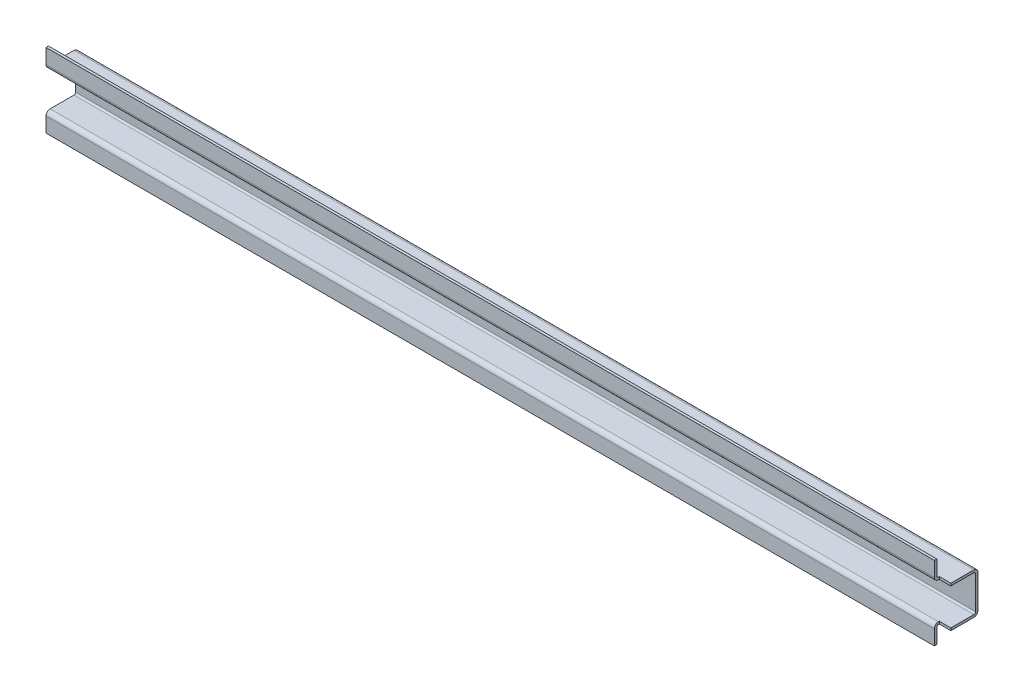
ISO-10303-21;
HEADER;
FILE_DESCRIPTION(('STEP AP214'),'2;1');
FILE_NAME('part.step','',(''),(''),'','','');
FILE_SCHEMA(('AUTOMOTIVE_DESIGN { 1 0 10303 214 1 1 1 1 }'));
ENDSEC;
DATA;
#1=APPLICATION_CONTEXT('core data for automotive mechanical design processes');
#2=APPLICATION_PROTOCOL_DEFINITION('international standard','automotive_design',2000,#1);
#3=PRODUCT_CONTEXT('',#1,'mechanical');
#4=PRODUCT('Part','Part','',(#3));
#5=PRODUCT_RELATED_PRODUCT_CATEGORY('part','',(#4));
#6=PRODUCT_DEFINITION_FORMATION('','',#4);
#7=PRODUCT_DEFINITION_CONTEXT('part definition',#1,'design');
#8=PRODUCT_DEFINITION('design','',#6,#7);
#9=PRODUCT_DEFINITION_SHAPE('','',#8);
#10=(LENGTH_UNIT() NAMED_UNIT(*) SI_UNIT(.MILLI.,.METRE.));
#11=(NAMED_UNIT(*) PLANE_ANGLE_UNIT() SI_UNIT($,.RADIAN.));
#12=(NAMED_UNIT(*) SI_UNIT($,.STERADIAN.) SOLID_ANGLE_UNIT());
#13=UNCERTAINTY_MEASURE_WITH_UNIT(LENGTH_MEASURE(1.E-05),#10,'distance_accuracy_value','');
#14=(GEOMETRIC_REPRESENTATION_CONTEXT(3) GLOBAL_UNCERTAINTY_ASSIGNED_CONTEXT((#13)) GLOBAL_UNIT_ASSIGNED_CONTEXT((#10,
#11,#12)) REPRESENTATION_CONTEXT('',''));
#15=CARTESIAN_POINT('',(0.,0.,0.));
#16=DIRECTION('',(0.,0.,1.));
#17=DIRECTION('',(1.,0.,0.));
#18=AXIS2_PLACEMENT_3D('',#15,#16,#17);
#19=CARTESIAN_POINT('',(273.000000000029,898.499999999999,-18.5));
#20=DIRECTION('',(-1.,0.,0.));
#21=DIRECTION('',(0.,0.,1.));
#22=AXIS2_PLACEMENT_3D('',#19,#20,#21);
#23=CYLINDRICAL_SURFACE('',#22,1.);
#24=CARTESIAN_POINT('',(273.000000000029,898.499999999999,-18.5));
#25=DIRECTION('',(-1.,0.,0.));
#26=DIRECTION('',(0.,0.,1.));
#27=AXIS2_PLACEMENT_3D('',#24,#25,#26);
#28=CIRCLE('',#27,1.);
#29=CARTESIAN_POINT('',(273.000000000029,899.499999999999,-18.5));
#30=VERTEX_POINT('',#29);
#31=CARTESIAN_POINT('',(273.000000000029,898.499999999999,-19.5));
#32=VERTEX_POINT('',#31);
#33=EDGE_CURVE('E235',#30,#32,#28,.T.);
#34=ORIENTED_EDGE('',*,*,#33,.F.);
#35=DIRECTION('',(1.,0.,0.));
#36=VECTOR('',#35,1.);
#37=CARTESIAN_POINT('',(273.000000000029,899.499999999999,-18.5));
#38=LINE('',#37,#36);
#39=CARTESIAN_POINT('',(-272.999999999971,899.499999999999,-18.5));
#40=VERTEX_POINT('',#39);
#41=EDGE_CURVE('E212',#30,#40,#38,.F.);
#42=ORIENTED_EDGE('',*,*,#41,.T.);
#43=CARTESIAN_POINT('',(-272.999999999971,898.499999999999,-18.5));
#44=DIRECTION('',(-1.,0.,0.));
#45=DIRECTION('',(0.,0.,1.));
#46=AXIS2_PLACEMENT_3D('',#43,#44,#45);
#47=CIRCLE('',#46,1.);
#48=CARTESIAN_POINT('',(-272.999999999971,898.499999999999,-19.5));
#49=VERTEX_POINT('',#48);
#50=EDGE_CURVE('E271',#49,#40,#47,.F.);
#51=ORIENTED_EDGE('',*,*,#50,.F.);
#52=DIRECTION('',(1.,0.,0.));
#53=VECTOR('',#52,1.);
#54=CARTESIAN_POINT('',(273.000000000029,898.499999999999,-19.5));
#55=LINE('',#54,#53);
#56=EDGE_CURVE('E223',#49,#32,#55,.T.);
#57=ORIENTED_EDGE('',*,*,#56,.T.);
#58=EDGE_LOOP('',(#34,#42,#51,#57));
#59=FACE_BOUND('',#58,.T.);
#60=ADVANCED_FACE('F16',(#59),#23,.F.);
#61=CARTESIAN_POINT('',(273.000000000029,910.999999999999,-1.49999999999999));
#62=DIRECTION('',(0.,1.,0.));
#63=DIRECTION('',(0.,0.,1.));
#64=AXIS2_PLACEMENT_3D('',#61,#62,#63);
#65=PLANE('',#64);
#66=DIRECTION('',(0.,0.,1.));
#67=VECTOR('',#66,1.);
#68=CARTESIAN_POINT('',(266.000000000029,910.999999999999,-4.50000000000011));
#69=LINE('',#68,#67);
#70=CARTESIAN_POINT('',(266.000000000029,910.999999999999,-2.99999999999999));
#71=VERTEX_POINT('',#70);
#72=CARTESIAN_POINT('',(266.000000000029,910.999999999999,-1.50000000000011));
#73=VERTEX_POINT('',#72);
#74=EDGE_CURVE('E179',#71,#73,#69,.T.);
#75=ORIENTED_EDGE('',*,*,#74,.F.);
#76=DIRECTION('',(1.,0.,0.));
#77=VECTOR('',#76,1.);
#78=CARTESIAN_POINT('',(273.000000000029,910.999999999999,-2.99999999999999));
#79=LINE('',#78,#77);
#80=CARTESIAN_POINT('',(-272.999999999971,910.999999999999,-2.99999999999999));
#81=VERTEX_POINT('',#80);
#82=EDGE_CURVE('E289',#81,#71,#79,.T.);
#83=ORIENTED_EDGE('',*,*,#82,.F.);
#84=DIRECTION('',(0.,0.,1.));
#85=VECTOR('',#84,1.);
#86=CARTESIAN_POINT('',(-272.999999999971,910.999999999999,-1.49999999999999));
#87=LINE('',#86,#85);
#88=CARTESIAN_POINT('',(-272.999999999971,910.999999999999,-1.49999999999999));
#89=VERTEX_POINT('',#88);
#90=EDGE_CURVE('E206',#81,#89,#87,.T.);
#91=ORIENTED_EDGE('',*,*,#90,.T.);
#92=DIRECTION('',(1.,0.,0.));
#93=VECTOR('',#92,1.);
#94=CARTESIAN_POINT('',(273.000000000029,910.999999999999,-1.49999999999999));
#95=LINE('',#94,#93);
#96=EDGE_CURVE('E199',#89,#73,#95,.T.);
#97=ORIENTED_EDGE('',*,*,#96,.T.);
#98=EDGE_LOOP('',(#75,#83,#91,#97));
#99=FACE_BOUND('',#98,.T.);
#100=ADVANCED_FACE('F205',(#99),#65,.T.);
#101=CARTESIAN_POINT('',(273.000000000029,874.999999999999,-4.));
#102=DIRECTION('',(-1.,0.,0.));
#103=DIRECTION('',(0.,0.,1.));
#104=AXIS2_PLACEMENT_3D('',#101,#102,#103);
#105=CYLINDRICAL_SURFACE('',#104,1.);
#106=DIRECTION('',(1.,0.,0.));
#107=VECTOR('',#106,1.);
#108=CARTESIAN_POINT('',(273.000000000029,875.999999999999,-4.));
#109=LINE('',#108,#107);
#110=CARTESIAN_POINT('',(266.000000000029,875.999999999999,-4.));
#111=VERTEX_POINT('',#110);
#112=CARTESIAN_POINT('',(-272.999999999971,875.999999999999,-4.));
#113=VERTEX_POINT('',#112);
#114=EDGE_CURVE('E287',#111,#113,#109,.F.);
#115=ORIENTED_EDGE('',*,*,#114,.F.);
#116=CARTESIAN_POINT('',(266.000000000029,874.999999999999,-4.));
#117=DIRECTION('',(-1.,0.,0.));
#118=DIRECTION('',(0.,-1.,0.));
#119=AXIS2_PLACEMENT_3D('',#116,#117,#118);
#120=CIRCLE('',#119,1.);
#121=CARTESIAN_POINT('',(266.000000000029,874.999999999999,-3.));
#122=VERTEX_POINT('',#121);
#123=EDGE_CURVE('E384',#111,#122,#120,.F.);
#124=ORIENTED_EDGE('',*,*,#123,.T.);
#125=DIRECTION('',(1.,0.,0.));
#126=VECTOR('',#125,1.);
#127=CARTESIAN_POINT('',(273.000000000029,874.999999999999,-3.));
#128=LINE('',#127,#126);
#129=CARTESIAN_POINT('',(-272.999999999971,874.999999999999,-3.));
#130=VERTEX_POINT('',#129);
#131=EDGE_CURVE('E279',#130,#122,#128,.T.);
#132=ORIENTED_EDGE('',*,*,#131,.F.);
#133=CARTESIAN_POINT('',(-272.999999999971,874.999999999999,-4.));
#134=DIRECTION('',(-1.,0.,0.));
#135=DIRECTION('',(0.,0.,1.));
#136=AXIS2_PLACEMENT_3D('',#133,#134,#135);
#137=CIRCLE('',#136,1.);
#138=EDGE_CURVE('E231',#113,#130,#137,.F.);
#139=ORIENTED_EDGE('',*,*,#138,.F.);
#140=EDGE_LOOP('',(#115,#124,#132,#139));
#141=FACE_BOUND('',#140,.T.);
#142=ADVANCED_FACE('F415',(#141),#105,.F.);
#143=CARTESIAN_POINT('',(273.000000000029,865.999999999999,-3.));
#144=DIRECTION('',(0.,-1.,0.));
#145=DIRECTION('',(0.,0.,-1.));
#146=AXIS2_PLACEMENT_3D('',#143,#144,#145);
#147=PLANE('',#146);
#148=DIRECTION('',(0.,0.,-1.));
#149=VECTOR('',#148,1.);
#150=CARTESIAN_POINT('',(266.000000000029,865.999999999999,-3.));
#151=LINE('',#150,#149);
#152=CARTESIAN_POINT('',(266.000000000029,865.999999999999,-1.50000000000011));
#153=VERTEX_POINT('',#152);
#154=CARTESIAN_POINT('',(266.000000000029,865.999999999999,-3.));
#155=VERTEX_POINT('',#154);
#156=EDGE_CURVE('E382',#153,#155,#151,.T.);
#157=ORIENTED_EDGE('',*,*,#156,.F.);
#158=DIRECTION('',(1.,0.,0.));
#159=VECTOR('',#158,1.);
#160=CARTESIAN_POINT('',(273.000000000029,865.999999999999,-1.5));
#161=LINE('',#160,#159);
#162=CARTESIAN_POINT('',(-272.999999999971,865.999999999998,-1.5));
#163=VERTEX_POINT('',#162);
#164=EDGE_CURVE('E276',#153,#163,#161,.F.);
#165=ORIENTED_EDGE('',*,*,#164,.T.);
#166=DIRECTION('',(0.,0.,-1.));
#167=VECTOR('',#166,1.);
#168=CARTESIAN_POINT('',(-272.999999999971,865.999999999999,-3.));
#169=LINE('',#168,#167);
#170=CARTESIAN_POINT('',(-272.999999999971,865.999999999998,-3.));
#171=VERTEX_POINT('',#170);
#172=EDGE_CURVE('E227',#163,#171,#169,.T.);
#173=ORIENTED_EDGE('',*,*,#172,.T.);
#174=DIRECTION('',(1.,0.,0.));
#175=VECTOR('',#174,1.);
#176=CARTESIAN_POINT('',(273.000000000029,865.999999999999,-3.));
#177=LINE('',#176,#175);
#178=EDGE_CURVE('E19',#155,#171,#177,.F.);
#179=ORIENTED_EDGE('',*,*,#178,.F.);
#180=EDGE_LOOP('',(#157,#165,#173,#179));
#181=FACE_BOUND('',#180,.T.);
#182=ADVANCED_FACE('F423',(#181),#147,.T.);
#183=CARTESIAN_POINT('',(273.000000000029,878.499999999999,-18.5));
#184=DIRECTION('',(-1.,0.,0.));
#185=DIRECTION('',(0.,0.,1.));
#186=AXIS2_PLACEMENT_3D('',#183,#184,#185);
#187=CYLINDRICAL_SURFACE('',#186,1.);
#188=CARTESIAN_POINT('',(273.000000000029,878.499999999999,-18.5));
#189=DIRECTION('',(-1.,0.,0.));
#190=DIRECTION('',(0.,0.,1.));
#191=AXIS2_PLACEMENT_3D('',#188,#189,#190);
#192=CIRCLE('',#191,1.);
#193=CARTESIAN_POINT('',(273.000000000029,878.499999999999,-19.5));
#194=VERTEX_POINT('',#193);
#195=CARTESIAN_POINT('',(273.000000000029,877.499999999999,-18.5));
#196=VERTEX_POINT('',#195);
#197=EDGE_CURVE('E266',#194,#196,#192,.T.);
#198=ORIENTED_EDGE('',*,*,#197,.F.);
#199=DIRECTION('',(1.,0.,0.));
#200=VECTOR('',#199,1.);
#201=CARTESIAN_POINT('',(273.000000000029,878.499999999999,-19.5));
#202=LINE('',#201,#200);
#203=CARTESIAN_POINT('',(-272.999999999971,878.499999999999,-19.5));
#204=VERTEX_POINT('',#203);
#205=EDGE_CURVE('E220',#194,#204,#202,.F.);
#206=ORIENTED_EDGE('',*,*,#205,.T.);
#207=CARTESIAN_POINT('',(-272.999999999971,878.499999999999,-18.5));
#208=DIRECTION('',(-1.,0.,0.));
#209=DIRECTION('',(0.,0.,1.));
#210=AXIS2_PLACEMENT_3D('',#207,#208,#209);
#211=CIRCLE('',#210,1.);
#212=CARTESIAN_POINT('',(-272.999999999971,877.499999999999,-18.5));
#213=VERTEX_POINT('',#212);
#214=EDGE_CURVE('E230',#213,#204,#211,.F.);
#215=ORIENTED_EDGE('',*,*,#214,.F.);
#216=DIRECTION('',(1.,0.,0.));
#217=VECTOR('',#216,1.);
#218=CARTESIAN_POINT('',(273.000000000029,877.499999999999,-18.5));
#219=LINE('',#218,#217);
#220=EDGE_CURVE('E344',#213,#196,#219,.T.);
#221=ORIENTED_EDGE('',*,*,#220,.T.);
#222=EDGE_LOOP('',(#198,#206,#215,#221));
#223=FACE_BOUND('',#222,.T.);
#224=ADVANCED_FACE('F435',(#223),#187,.F.);
#225=CARTESIAN_POINT('',(273.000000000029,901.999999999999,-3.99999999999999));
#226=DIRECTION('',(-1.,0.,0.));
#227=DIRECTION('',(0.,0.,1.));
#228=AXIS2_PLACEMENT_3D('',#225,#226,#227);
#229=CYLINDRICAL_SURFACE('',#228,1.);
#230=DIRECTION('',(1.,0.,0.));
#231=VECTOR('',#230,1.);
#232=CARTESIAN_POINT('',(273.000000000029,901.999999999999,-2.99999999999999));
#233=LINE('',#232,#231);
#234=CARTESIAN_POINT('',(266.000000000029,901.999999999999,-2.99999999999999));
#235=VERTEX_POINT('',#234);
#236=CARTESIAN_POINT('',(-272.999999999971,901.999999999999,-2.99999999999999));
#237=VERTEX_POINT('',#236);
#238=EDGE_CURVE('E209',#235,#237,#233,.F.);
#239=ORIENTED_EDGE('',*,*,#238,.F.);
#240=CARTESIAN_POINT('',(266.000000000029,901.999999999999,-3.99999999999999));
#241=DIRECTION('',(-1.,0.,0.));
#242=DIRECTION('',(0.,-1.,0.));
#243=AXIS2_PLACEMENT_3D('',#240,#241,#242);
#244=CIRCLE('',#243,1.);
#245=CARTESIAN_POINT('',(266.000000000029,900.999999999999,-3.99999999999999));
#246=VERTEX_POINT('',#245);
#247=EDGE_CURVE('E372',#235,#246,#244,.F.);
#248=ORIENTED_EDGE('',*,*,#247,.T.);
#249=DIRECTION('',(1.,0.,0.));
#250=VECTOR('',#249,1.);
#251=CARTESIAN_POINT('',(273.000000000029,900.999999999999,-3.99999999999999));
#252=LINE('',#251,#250);
#253=CARTESIAN_POINT('',(-272.999999999971,900.999999999999,-3.99999999999999));
#254=VERTEX_POINT('',#253);
#255=EDGE_CURVE('E292',#254,#246,#252,.T.);
#256=ORIENTED_EDGE('',*,*,#255,.F.);
#257=CARTESIAN_POINT('',(-272.999999999971,901.999999999999,-3.99999999999999));
#258=DIRECTION('',(-1.,0.,0.));
#259=DIRECTION('',(0.,0.,1.));
#260=AXIS2_PLACEMENT_3D('',#257,#258,#259);
#261=CIRCLE('',#260,1.);
#262=EDGE_CURVE('E226',#237,#254,#261,.F.);
#263=ORIENTED_EDGE('',*,*,#262,.F.);
#264=EDGE_LOOP('',(#239,#248,#256,#263));
#265=FACE_BOUND('',#264,.T.);
#266=ADVANCED_FACE('F460',(#265),#229,.F.);
#267=CARTESIAN_POINT('',(273.000000000029,900.999999999999,-19.5));
#268=DIRECTION('',(0.,0.,-1.));
#269=DIRECTION('',(0.,1.,0.));
#270=AXIS2_PLACEMENT_3D('',#267,#268,#269);
#271=PLANE('',#270);
#272=DIRECTION('',(0.,1.,0.));
#273=VECTOR('',#272,1.);
#274=CARTESIAN_POINT('',(273.000000000029,899.499999999999,-19.5));
#275=LINE('',#274,#273);
#276=EDGE_CURVE('E295',#32,#194,#275,.F.);
#277=ORIENTED_EDGE('',*,*,#276,.F.);
#278=ORIENTED_EDGE('',*,*,#56,.F.);
#279=DIRECTION('',(0.,1.,0.));
#280=VECTOR('',#279,1.);
#281=CARTESIAN_POINT('',(-272.999999999971,877.499999999999,-19.5));
#282=LINE('',#281,#280);
#283=EDGE_CURVE('E291',#204,#49,#282,.T.);
#284=ORIENTED_EDGE('',*,*,#283,.F.);
#285=ORIENTED_EDGE('',*,*,#205,.F.);
#286=EDGE_LOOP('',(#277,#278,#284,#285));
#287=FACE_BOUND('',#286,.T.);
#288=ADVANCED_FACE('F439',(#287),#271,.F.);
#289=CARTESIAN_POINT('',(273.000000000029,899.499999999999,-2.99999999999999));
#290=DIRECTION('',(0.,1.,0.));
#291=DIRECTION('',(0.,0.,1.));
#292=AXIS2_PLACEMENT_3D('',#289,#290,#291);
#293=PLANE('',#292);
#294=DIRECTION('',(-1.,0.,0.));
#295=VECTOR('',#294,1.);
#296=CARTESIAN_POINT('',(273.000000000029,899.499999999999,-4.50000000000011));
#297=LINE('',#296,#295);
#298=CARTESIAN_POINT('',(273.000000000029,899.499999999999,-4.50000000000011));
#299=VERTEX_POINT('',#298);
#300=CARTESIAN_POINT('',(266.000000000029,899.499999999999,-4.50000000000011));
#301=VERTEX_POINT('',#300);
#302=EDGE_CURVE('E41',#299,#301,#297,.T.);
#303=ORIENTED_EDGE('',*,*,#302,.T.);
#304=DIRECTION('',(0.,0.,1.));
#305=VECTOR('',#304,1.);
#306=CARTESIAN_POINT('',(266.000000000029,899.499999999999,-2.99999999999999));
#307=LINE('',#306,#305);
#308=CARTESIAN_POINT('',(266.000000000029,899.499999999999,-3.99999999999999));
#309=VERTEX_POINT('',#308);
#310=EDGE_CURVE('E273',#301,#309,#307,.T.);
#311=ORIENTED_EDGE('',*,*,#310,.T.);
#312=DIRECTION('',(-1.,0.,0.));
#313=VECTOR('',#312,1.);
#314=CARTESIAN_POINT('',(273.000000000029,899.499999999999,-4.));
#315=LINE('',#314,#313);
#316=CARTESIAN_POINT('',(-272.999999999971,899.499999999999,-4.));
#317=VERTEX_POINT('',#316);
#318=EDGE_CURVE('E207',#317,#309,#315,.F.);
#319=ORIENTED_EDGE('',*,*,#318,.F.);
#320=DIRECTION('',(0.,0.,1.));
#321=VECTOR('',#320,1.);
#322=CARTESIAN_POINT('',(-272.999999999971,899.499999999999,-18.5));
#323=LINE('',#322,#321);
#324=EDGE_CURVE('E259',#40,#317,#323,.T.);
#325=ORIENTED_EDGE('',*,*,#324,.F.);
#326=ORIENTED_EDGE('',*,*,#41,.F.);
#327=DIRECTION('',(0.,0.,-1.));
#328=VECTOR('',#327,1.);
#329=CARTESIAN_POINT('',(273.000000000029,899.499999999999,-18.5));
#330=LINE('',#329,#328);
#331=EDGE_CURVE('E264',#299,#30,#330,.T.);
#332=ORIENTED_EDGE('',*,*,#331,.F.);
#333=EDGE_LOOP('',(#303,#311,#319,#325,#326,#332));
#334=FACE_BOUND('',#333,.T.);
#335=ADVANCED_FACE('F446',(#334),#293,.F.);
#336=CARTESIAN_POINT('',(273.000000000029,901.999999999999,-3.99999999999999));
#337=DIRECTION('',(-1.,0.,0.));
#338=DIRECTION('',(0.,0.,1.));
#339=AXIS2_PLACEMENT_3D('',#336,#337,#338);
#340=CYLINDRICAL_SURFACE('',#339,2.5);
#341=CARTESIAN_POINT('',(266.000000000029,901.999999999999,-3.99999999999999));
#342=DIRECTION('',(-1.,0.,0.));
#343=DIRECTION('',(0.,-1.,0.));
#344=AXIS2_PLACEMENT_3D('',#341,#342,#343);
#345=CIRCLE('',#344,2.5);
#346=CARTESIAN_POINT('',(266.000000000029,901.999999999999,-1.50000000000011));
#347=VERTEX_POINT('',#346);
#348=EDGE_CURVE('E389',#347,#309,#345,.F.);
#349=ORIENTED_EDGE('',*,*,#348,.F.);
#350=DIRECTION('',(1.,0.,0.));
#351=VECTOR('',#350,1.);
#352=CARTESIAN_POINT('',(273.000000000029,901.999999999999,-1.49999999999999));
#353=LINE('',#352,#351);
#354=CARTESIAN_POINT('',(-272.999999999971,901.999999999999,-1.49999999999999));
#355=VERTEX_POINT('',#354);
#356=EDGE_CURVE('E201',#347,#355,#353,.F.);
#357=ORIENTED_EDGE('',*,*,#356,.T.);
#358=CARTESIAN_POINT('',(-272.999999999971,901.999999999999,-3.99999999999999));
#359=DIRECTION('',(-1.,0.,0.));
#360=DIRECTION('',(0.,0.,1.));
#361=AXIS2_PLACEMENT_3D('',#358,#359,#360);
#362=CIRCLE('',#361,2.5);
#363=EDGE_CURVE('E255',#317,#355,#362,.T.);
#364=ORIENTED_EDGE('',*,*,#363,.F.);
#365=ORIENTED_EDGE('',*,*,#318,.T.);
#366=EDGE_LOOP('',(#349,#357,#364,#365));
#367=FACE_BOUND('',#366,.T.);
#368=ADVANCED_FACE('F449',(#367),#340,.T.);
#369=CARTESIAN_POINT('',(273.000000000029,910.999999999999,-1.49999999999999));
#370=DIRECTION('',(0.,0.,-1.));
#371=DIRECTION('',(0.,1.,0.));
#372=AXIS2_PLACEMENT_3D('',#369,#370,#371);
#373=PLANE('',#372);
#374=ORIENTED_EDGE('',*,*,#356,.F.);
#375=DIRECTION('',(0.,-1.,0.));
#376=VECTOR('',#375,1.);
#377=CARTESIAN_POINT('',(266.000000000029,910.999999999999,-1.50000000000011));
#378=LINE('',#377,#376);
#379=EDGE_CURVE('E183',#73,#347,#378,.T.);
#380=ORIENTED_EDGE('',*,*,#379,.F.);
#381=ORIENTED_EDGE('',*,*,#96,.F.);
#382=DIRECTION('',(0.,1.,0.));
#383=VECTOR('',#382,1.);
#384=CARTESIAN_POINT('',(-272.999999999971,877.499999999999,-1.49999999999999));
#385=LINE('',#384,#383);
#386=EDGE_CURVE('E258',#355,#89,#385,.T.);
#387=ORIENTED_EDGE('',*,*,#386,.F.);
#388=EDGE_LOOP('',(#374,#380,#381,#387));
#389=FACE_BOUND('',#388,.T.);
#390=ADVANCED_FACE('F197',(#389),#373,.F.);
#391=CARTESIAN_POINT('',(273.000000000029,910.999999999999,-2.99999999999999));
#392=DIRECTION('',(0.,0.,-1.));
#393=DIRECTION('',(0.,1.,0.));
#394=AXIS2_PLACEMENT_3D('',#391,#392,#393);
#395=PLANE('',#394);
#396=DIRECTION('',(0.,1.,0.));
#397=VECTOR('',#396,1.);
#398=CARTESIAN_POINT('',(266.000000000029,910.999999999999,-2.99999999999999));
#399=LINE('',#398,#397);
#400=EDGE_CURVE('E186',#235,#71,#399,.T.);
#401=ORIENTED_EDGE('',*,*,#400,.F.);
#402=ORIENTED_EDGE('',*,*,#238,.T.);
#403=DIRECTION('',(0.,1.,0.));
#404=VECTOR('',#403,1.);
#405=CARTESIAN_POINT('',(-272.999999999971,877.499999999999,-2.99999999999999));
#406=LINE('',#405,#404);
#407=EDGE_CURVE('E304',#81,#237,#406,.F.);
#408=ORIENTED_EDGE('',*,*,#407,.F.);
#409=ORIENTED_EDGE('',*,*,#82,.T.);
#410=EDGE_LOOP('',(#401,#402,#408,#409));
#411=FACE_BOUND('',#410,.T.);
#412=ADVANCED_FACE('F301',(#411),#395,.T.);
#413=CARTESIAN_POINT('',(273.000000000029,875.999999999999,-21.));
#414=DIRECTION('',(0.,-1.,0.));
#415=DIRECTION('',(0.,0.,-1.));
#416=AXIS2_PLACEMENT_3D('',#413,#414,#415);
#417=PLANE('',#416);
#418=DIRECTION('',(0.,0.,-1.));
#419=VECTOR('',#418,1.);
#420=CARTESIAN_POINT('',(266.000000000029,875.999999999999,-21.));
#421=LINE('',#420,#419);
#422=CARTESIAN_POINT('',(266.000000000029,875.999999999999,-4.50000000000011));
#423=VERTEX_POINT('',#422);
#424=EDGE_CURVE('E387',#111,#423,#421,.T.);
#425=ORIENTED_EDGE('',*,*,#424,.F.);
#426=ORIENTED_EDGE('',*,*,#114,.T.);
#427=DIRECTION('',(0.,0.,1.));
#428=VECTOR('',#427,1.);
#429=CARTESIAN_POINT('',(-272.999999999971,875.999999999999,-18.5));
#430=LINE('',#429,#428);
#431=CARTESIAN_POINT('',(-272.999999999971,875.999999999999,-18.5));
#432=VERTEX_POINT('',#431);
#433=EDGE_CURVE('E253',#432,#113,#430,.T.);
#434=ORIENTED_EDGE('',*,*,#433,.F.);
#435=DIRECTION('',(-1.,0.,0.));
#436=VECTOR('',#435,1.);
#437=CARTESIAN_POINT('',(273.000000000029,875.999999999999,-18.5));
#438=LINE('',#437,#436);
#439=CARTESIAN_POINT('',(273.000000000029,875.999999999999,-18.5));
#440=VERTEX_POINT('',#439);
#441=EDGE_CURVE('E263',#440,#432,#438,.T.);
#442=ORIENTED_EDGE('',*,*,#441,.F.);
#443=DIRECTION('',(0.,0.,-1.));
#444=VECTOR('',#443,1.);
#445=CARTESIAN_POINT('',(273.000000000029,875.999999999999,-18.5));
#446=LINE('',#445,#444);
#447=CARTESIAN_POINT('',(273.000000000029,875.999999999999,-4.50000000000011));
#448=VERTEX_POINT('',#447);
#449=EDGE_CURVE('E335',#448,#440,#446,.T.);
#450=ORIENTED_EDGE('',*,*,#449,.F.);
#451=DIRECTION('',(1.,0.,0.));
#452=VECTOR('',#451,1.);
#453=CARTESIAN_POINT('',(273.000000000029,875.999999999999,-4.50000000000011));
#454=LINE('',#453,#452);
#455=EDGE_CURVE('E33',#423,#448,#454,.T.);
#456=ORIENTED_EDGE('',*,*,#455,.F.);
#457=EDGE_LOOP('',(#425,#426,#434,#442,#450,#456));
#458=FACE_BOUND('',#457,.T.);
#459=ADVANCED_FACE('F411',(#458),#417,.T.);
#460=CARTESIAN_POINT('',(273.000000000029,875.999999999999,-3.));
#461=DIRECTION('',(0.,0.,-1.));
#462=DIRECTION('',(0.,1.,0.));
#463=AXIS2_PLACEMENT_3D('',#460,#461,#462);
#464=PLANE('',#463);
#465=DIRECTION('',(0.,1.,0.));
#466=VECTOR('',#465,1.);
#467=CARTESIAN_POINT('',(266.000000000029,875.999999999999,-3.));
#468=LINE('',#467,#466);
#469=EDGE_CURVE('E380',#155,#122,#468,.T.);
#470=ORIENTED_EDGE('',*,*,#469,.F.);
#471=ORIENTED_EDGE('',*,*,#178,.T.);
#472=DIRECTION('',(0.,1.,0.));
#473=VECTOR('',#472,1.);
#474=CARTESIAN_POINT('',(-272.999999999971,877.499999999999,-3.));
#475=LINE('',#474,#473);
#476=EDGE_CURVE('E396',#130,#171,#475,.F.);
#477=ORIENTED_EDGE('',*,*,#476,.F.);
#478=ORIENTED_EDGE('',*,*,#131,.T.);
#479=EDGE_LOOP('',(#470,#471,#477,#478));
#480=FACE_BOUND('',#479,.T.);
#481=ADVANCED_FACE('F419',(#480),#464,.T.);
#482=CARTESIAN_POINT('',(273.000000000029,875.999999999999,-1.5));
#483=DIRECTION('',(0.,0.,-1.));
#484=DIRECTION('',(0.,1.,0.));
#485=AXIS2_PLACEMENT_3D('',#482,#483,#484);
#486=PLANE('',#485);
#487=ORIENTED_EDGE('',*,*,#164,.F.);
#488=CARTESIAN_POINT('',(266.000000000029,874.999999999999,-1.50000000000011));
#489=VERTEX_POINT('',#488);
#490=EDGE_CURVE('E203',#489,#153,#378,.T.);
#491=ORIENTED_EDGE('',*,*,#490,.F.);
#492=DIRECTION('',(-1.,0.,0.));
#493=VECTOR('',#492,1.);
#494=CARTESIAN_POINT('',(273.000000000029,874.999999999999,-1.5));
#495=LINE('',#494,#493);
#496=CARTESIAN_POINT('',(-272.999999999971,874.999999999999,-1.5));
#497=VERTEX_POINT('',#496);
#498=EDGE_CURVE('E278',#497,#489,#495,.F.);
#499=ORIENTED_EDGE('',*,*,#498,.F.);
#500=DIRECTION('',(0.,1.,0.));
#501=VECTOR('',#500,1.);
#502=CARTESIAN_POINT('',(-272.999999999971,877.499999999999,-1.5));
#503=LINE('',#502,#501);
#504=EDGE_CURVE('E249',#163,#497,#503,.T.);
#505=ORIENTED_EDGE('',*,*,#504,.F.);
#506=EDGE_LOOP('',(#487,#491,#499,#505));
#507=FACE_BOUND('',#506,.T.);
#508=ADVANCED_FACE('F361',(#507),#486,.F.);
#509=CARTESIAN_POINT('',(273.000000000029,874.999999999999,-4.));
#510=DIRECTION('',(-1.,0.,0.));
#511=DIRECTION('',(0.,0.,1.));
#512=AXIS2_PLACEMENT_3D('',#509,#510,#511);
#513=CYLINDRICAL_SURFACE('',#512,2.5);
#514=CARTESIAN_POINT('',(266.000000000029,874.999999999999,-4.));
#515=DIRECTION('',(-1.,0.,0.));
#516=DIRECTION('',(0.,-1.,0.));
#517=AXIS2_PLACEMENT_3D('',#514,#515,#516);
#518=CIRCLE('',#517,2.5);
#519=CARTESIAN_POINT('',(266.000000000029,877.499999999999,-4.));
#520=VERTEX_POINT('',#519);
#521=EDGE_CURVE('E354',#520,#489,#518,.F.);
#522=ORIENTED_EDGE('',*,*,#521,.F.);
#523=DIRECTION('',(1.,0.,0.));
#524=VECTOR('',#523,1.);
#525=CARTESIAN_POINT('',(273.000000000029,877.499999999999,-4.));
#526=LINE('',#525,#524);
#527=CARTESIAN_POINT('',(-272.999999999971,877.499999999999,-4.));
#528=VERTEX_POINT('',#527);
#529=EDGE_CURVE('E296',#520,#528,#526,.F.);
#530=ORIENTED_EDGE('',*,*,#529,.T.);
#531=CARTESIAN_POINT('',(-272.999999999971,874.999999999999,-4.));
#532=DIRECTION('',(-1.,0.,0.));
#533=DIRECTION('',(0.,0.,1.));
#534=AXIS2_PLACEMENT_3D('',#531,#532,#533);
#535=CIRCLE('',#534,2.5);
#536=EDGE_CURVE('E246',#497,#528,#535,.T.);
#537=ORIENTED_EDGE('',*,*,#536,.F.);
#538=ORIENTED_EDGE('',*,*,#498,.T.);
#539=EDGE_LOOP('',(#522,#530,#537,#538));
#540=FACE_BOUND('',#539,.T.);
#541=ADVANCED_FACE('F353',(#540),#513,.T.);
#542=CARTESIAN_POINT('',(273.000000000029,877.499999999999,-21.));
#543=DIRECTION('',(0.,-1.,0.));
#544=DIRECTION('',(0.,0.,-1.));
#545=AXIS2_PLACEMENT_3D('',#542,#543,#544);
#546=PLANE('',#545);
#547=ORIENTED_EDGE('',*,*,#529,.F.);
#548=DIRECTION('',(0.,0.,-1.));
#549=VECTOR('',#548,1.);
#550=CARTESIAN_POINT('',(266.000000000029,877.499999999999,-21.));
#551=LINE('',#550,#549);
#552=CARTESIAN_POINT('',(266.000000000029,877.499999999999,-4.50000000000011));
#553=VERTEX_POINT('',#552);
#554=EDGE_CURVE('E376',#520,#553,#551,.T.);
#555=ORIENTED_EDGE('',*,*,#554,.T.);
#556=DIRECTION('',(1.,0.,0.));
#557=VECTOR('',#556,1.);
#558=CARTESIAN_POINT('',(273.000000000029,877.499999999999,-4.50000000000011));
#559=LINE('',#558,#557);
#560=CARTESIAN_POINT('',(273.000000000029,877.499999999999,-4.50000000000011));
#561=VERTEX_POINT('',#560);
#562=EDGE_CURVE('E367',#553,#561,#559,.T.);
#563=ORIENTED_EDGE('',*,*,#562,.T.);
#564=DIRECTION('',(0.,0.,-1.));
#565=VECTOR('',#564,1.);
#566=CARTESIAN_POINT('',(273.000000000029,877.499999999999,-18.5));
#567=LINE('',#566,#565);
#568=EDGE_CURVE('E337',#196,#561,#567,.F.);
#569=ORIENTED_EDGE('',*,*,#568,.F.);
#570=ORIENTED_EDGE('',*,*,#220,.F.);
#571=DIRECTION('',(0.,0.,1.));
#572=VECTOR('',#571,1.);
#573=CARTESIAN_POINT('',(-272.999999999971,877.499999999999,-18.5));
#574=LINE('',#573,#572);
#575=EDGE_CURVE('E245',#528,#213,#574,.F.);
#576=ORIENTED_EDGE('',*,*,#575,.F.);
#577=EDGE_LOOP('',(#547,#555,#563,#569,#570,#576));
#578=FACE_BOUND('',#577,.T.);
#579=ADVANCED_FACE('F431',(#578),#546,.F.);
#580=CARTESIAN_POINT('',(273.000000000029,900.999999999999,-2.99999999999999));
#581=DIRECTION('',(0.,1.,0.));
#582=DIRECTION('',(0.,0.,1.));
#583=AXIS2_PLACEMENT_3D('',#580,#581,#582);
#584=PLANE('',#583);
#585=DIRECTION('',(0.,0.,1.));
#586=VECTOR('',#585,1.);
#587=CARTESIAN_POINT('',(266.000000000029,900.999999999999,-2.99999999999999));
#588=LINE('',#587,#586);
#589=CARTESIAN_POINT('',(266.000000000029,900.999999999999,-4.50000000000011));
#590=VERTEX_POINT('',#589);
#591=EDGE_CURVE('E11',#590,#246,#588,.T.);
#592=ORIENTED_EDGE('',*,*,#591,.F.);
#593=DIRECTION('',(-1.,0.,0.));
#594=VECTOR('',#593,1.);
#595=CARTESIAN_POINT('',(273.000000000029,900.999999999999,-4.50000000000011));
#596=LINE('',#595,#594);
#597=CARTESIAN_POINT('',(273.000000000029,900.999999999999,-4.50000000000011));
#598=VERTEX_POINT('',#597);
#599=EDGE_CURVE('E191',#598,#590,#596,.T.);
#600=ORIENTED_EDGE('',*,*,#599,.F.);
#601=DIRECTION('',(0.,0.,-1.));
#602=VECTOR('',#601,1.);
#603=CARTESIAN_POINT('',(273.000000000029,900.999999999999,-18.5));
#604=LINE('',#603,#602);
#605=CARTESIAN_POINT('',(273.000000000029,900.999999999999,-18.5));
#606=VERTEX_POINT('',#605);
#607=EDGE_CURVE('E332',#606,#598,#604,.F.);
#608=ORIENTED_EDGE('',*,*,#607,.F.);
#609=DIRECTION('',(-1.,0.,0.));
#610=VECTOR('',#609,1.);
#611=CARTESIAN_POINT('',(273.000000000029,900.999999999999,-18.5));
#612=LINE('',#611,#610);
#613=CARTESIAN_POINT('',(-272.999999999971,900.999999999999,-18.5));
#614=VERTEX_POINT('',#613);
#615=EDGE_CURVE('E241',#614,#606,#612,.F.);
#616=ORIENTED_EDGE('',*,*,#615,.F.);
#617=DIRECTION('',(0.,0.,1.));
#618=VECTOR('',#617,1.);
#619=CARTESIAN_POINT('',(-272.999999999971,900.999999999999,-18.5));
#620=LINE('',#619,#618);
#621=EDGE_CURVE('E254',#254,#614,#620,.F.);
#622=ORIENTED_EDGE('',*,*,#621,.F.);
#623=ORIENTED_EDGE('',*,*,#255,.T.);
#624=EDGE_LOOP('',(#592,#600,#608,#616,#622,#623));
#625=FACE_BOUND('',#624,.T.);
#626=ADVANCED_FACE('F455',(#625),#584,.T.);
#627=CARTESIAN_POINT('',(273.000000000029,899.499999999999,-18.5));
#628=DIRECTION('',(1.,0.,0.));
#629=DIRECTION('',(0.,0.,-1.));
#630=AXIS2_PLACEMENT_3D('',#627,#628,#629);
#631=PLANE('',#630);
#632=DIRECTION('',(0.,1.,0.));
#633=VECTOR('',#632,1.);
#634=CARTESIAN_POINT('',(273.000000000029,899.499999999999,-4.50000000000011));
#635=LINE('',#634,#633);
#636=EDGE_CURVE('E25',#448,#561,#635,.T.);
#637=ORIENTED_EDGE('',*,*,#636,.F.);
#638=ORIENTED_EDGE('',*,*,#449,.T.);
#639=CARTESIAN_POINT('',(273.000000000029,878.499999999999,-18.5));
#640=DIRECTION('',(-1.,0.,0.));
#641=DIRECTION('',(0.,0.,1.));
#642=AXIS2_PLACEMENT_3D('',#639,#640,#641);
#643=CIRCLE('',#642,2.5);
#644=CARTESIAN_POINT('',(273.000000000029,878.499999999999,-21.));
#645=VERTEX_POINT('',#644);
#646=EDGE_CURVE('E260',#645,#440,#643,.T.);
#647=ORIENTED_EDGE('',*,*,#646,.F.);
#648=DIRECTION('',(0.,1.,0.));
#649=VECTOR('',#648,1.);
#650=CARTESIAN_POINT('',(273.000000000029,900.999999999999,-21.));
#651=LINE('',#650,#649);
#652=CARTESIAN_POINT('',(273.000000000029,898.499999999999,-21.));
#653=VERTEX_POINT('',#652);
#654=EDGE_CURVE('E324',#653,#645,#651,.F.);
#655=ORIENTED_EDGE('',*,*,#654,.F.);
#656=CARTESIAN_POINT('',(273.000000000029,898.499999999999,-18.5));
#657=DIRECTION('',(-1.,0.,0.));
#658=DIRECTION('',(0.,0.,1.));
#659=AXIS2_PLACEMENT_3D('',#656,#657,#658);
#660=CIRCLE('',#659,2.5);
#661=EDGE_CURVE('E242',#606,#653,#660,.T.);
#662=ORIENTED_EDGE('',*,*,#661,.F.);
#663=ORIENTED_EDGE('',*,*,#607,.T.);
#664=EDGE_CURVE('E274',#299,#598,#635,.T.);
#665=ORIENTED_EDGE('',*,*,#664,.F.);
#666=ORIENTED_EDGE('',*,*,#331,.T.);
#667=ORIENTED_EDGE('',*,*,#33,.T.);
#668=ORIENTED_EDGE('',*,*,#276,.T.);
#669=ORIENTED_EDGE('',*,*,#197,.T.);
#670=ORIENTED_EDGE('',*,*,#568,.T.);
#671=EDGE_LOOP('',(#637,#638,#647,#655,#662,#663,#665,#666,#667,#668,#669,#670));
#672=FACE_BOUND('',#671,.T.);
#673=ADVANCED_FACE('F428',(#672),#631,.T.);
#674=CARTESIAN_POINT('',(273.000000000029,878.499999999999,-18.5));
#675=DIRECTION('',(-1.,0.,0.));
#676=DIRECTION('',(0.,0.,1.));
#677=AXIS2_PLACEMENT_3D('',#674,#675,#676);
#678=CYLINDRICAL_SURFACE('',#677,2.5);
#679=CARTESIAN_POINT('',(-272.999999999971,878.499999999999,-18.5));
#680=DIRECTION('',(-1.,0.,0.));
#681=DIRECTION('',(0.,0.,1.));
#682=AXIS2_PLACEMENT_3D('',#679,#680,#681);
#683=CIRCLE('',#682,2.5);
#684=CARTESIAN_POINT('',(-272.999999999971,878.499999999999,-21.));
#685=VERTEX_POINT('',#684);
#686=EDGE_CURVE('E250',#685,#432,#683,.T.);
#687=ORIENTED_EDGE('',*,*,#686,.F.);
#688=DIRECTION('',(1.,0.,0.));
#689=VECTOR('',#688,1.);
#690=CARTESIAN_POINT('',(273.000000000029,878.499999999999,-21.));
#691=LINE('',#690,#689);
#692=EDGE_CURVE('E320',#645,#685,#691,.F.);
#693=ORIENTED_EDGE('',*,*,#692,.F.);
#694=ORIENTED_EDGE('',*,*,#646,.T.);
#695=ORIENTED_EDGE('',*,*,#441,.T.);
#696=EDGE_LOOP('',(#687,#693,#694,#695));
#697=FACE_BOUND('',#696,.T.);
#698=ADVANCED_FACE('F467',(#697),#678,.T.);
#699=CARTESIAN_POINT('',(-272.999999999971,877.499999999999,-18.5));
#700=DIRECTION('',(-1.,0.,0.));
#701=DIRECTION('',(0.,0.,1.));
#702=AXIS2_PLACEMENT_3D('',#699,#700,#701);
#703=PLANE('',#702);
#704=ORIENTED_EDGE('',*,*,#575,.T.);
#705=ORIENTED_EDGE('',*,*,#214,.T.);
#706=ORIENTED_EDGE('',*,*,#283,.T.);
#707=ORIENTED_EDGE('',*,*,#50,.T.);
#708=ORIENTED_EDGE('',*,*,#324,.T.);
#709=ORIENTED_EDGE('',*,*,#363,.T.);
#710=ORIENTED_EDGE('',*,*,#386,.T.);
#711=ORIENTED_EDGE('',*,*,#90,.F.);
#712=ORIENTED_EDGE('',*,*,#407,.T.);
#713=ORIENTED_EDGE('',*,*,#262,.T.);
#714=ORIENTED_EDGE('',*,*,#621,.T.);
#715=CARTESIAN_POINT('',(-272.999999999971,898.499999999999,-18.5));
#716=DIRECTION('',(-1.,0.,0.));
#717=DIRECTION('',(0.,0.,1.));
#718=AXIS2_PLACEMENT_3D('',#715,#716,#717);
#719=CIRCLE('',#718,2.5);
#720=CARTESIAN_POINT('',(-272.999999999971,898.499999999999,-21.));
#721=VERTEX_POINT('',#720);
#722=EDGE_CURVE('E238',#721,#614,#719,.F.);
#723=ORIENTED_EDGE('',*,*,#722,.F.);
#724=DIRECTION('',(0.,1.,0.));
#725=VECTOR('',#724,1.);
#726=CARTESIAN_POINT('',(-272.999999999971,900.999999999999,-21.));
#727=LINE('',#726,#725);
#728=EDGE_CURVE('E323',#685,#721,#727,.T.);
#729=ORIENTED_EDGE('',*,*,#728,.F.);
#730=ORIENTED_EDGE('',*,*,#686,.T.);
#731=ORIENTED_EDGE('',*,*,#433,.T.);
#732=ORIENTED_EDGE('',*,*,#138,.T.);
#733=ORIENTED_EDGE('',*,*,#476,.T.);
#734=ORIENTED_EDGE('',*,*,#172,.F.);
#735=ORIENTED_EDGE('',*,*,#504,.T.);
#736=ORIENTED_EDGE('',*,*,#536,.T.);
#737=EDGE_LOOP('',(#704,#705,#706,#707,#708,#709,#710,#711,#712,#713,#714,#723,#729,#730,#731,
#732,#733,#734,#735,#736));
#738=FACE_BOUND('',#737,.T.);
#739=ADVANCED_FACE('F404',(#738),#703,.T.);
#740=CARTESIAN_POINT('',(273.000000000029,898.499999999999,-18.5));
#741=DIRECTION('',(-1.,0.,0.));
#742=DIRECTION('',(0.,0.,1.));
#743=AXIS2_PLACEMENT_3D('',#740,#741,#742);
#744=CYLINDRICAL_SURFACE('',#743,2.5);
#745=ORIENTED_EDGE('',*,*,#722,.T.);
#746=ORIENTED_EDGE('',*,*,#615,.T.);
#747=ORIENTED_EDGE('',*,*,#661,.T.);
#748=DIRECTION('',(1.,0.,0.));
#749=VECTOR('',#748,1.);
#750=CARTESIAN_POINT('',(273.000000000029,898.499999999999,-21.));
#751=LINE('',#750,#749);
#752=EDGE_CURVE('E275',#721,#653,#751,.T.);
#753=ORIENTED_EDGE('',*,*,#752,.F.);
#754=EDGE_LOOP('',(#745,#746,#747,#753));
#755=FACE_BOUND('',#754,.T.);
#756=ADVANCED_FACE('F463',(#755),#744,.T.);
#757=CARTESIAN_POINT('',(273.000000000029,900.999999999999,-21.));
#758=DIRECTION('',(0.,0.,-1.));
#759=DIRECTION('',(0.,1.,0.));
#760=AXIS2_PLACEMENT_3D('',#757,#758,#759);
#761=PLANE('',#760);
#762=ORIENTED_EDGE('',*,*,#728,.T.);
#763=ORIENTED_EDGE('',*,*,#752,.T.);
#764=ORIENTED_EDGE('',*,*,#654,.T.);
#765=ORIENTED_EDGE('',*,*,#692,.T.);
#766=EDGE_LOOP('',(#762,#763,#764,#765));
#767=FACE_BOUND('',#766,.T.);
#768=ADVANCED_FACE('F465',(#767),#761,.T.);
#769=CARTESIAN_POINT('',(0.,0.,-4.50000000000011));
#770=DIRECTION('',(0.,0.,-1.));
#771=DIRECTION('',(-1.,0.,0.));
#772=AXIS2_PLACEMENT_3D('',#769,#770,#771);
#773=PLANE('',#772);
#774=ORIENTED_EDGE('',*,*,#664,.T.);
#775=ORIENTED_EDGE('',*,*,#599,.T.);
#776=DIRECTION('',(0.,-1.,0.));
#777=VECTOR('',#776,1.);
#778=CARTESIAN_POINT('',(266.000000000029,910.999999999999,-4.50000000000011));
#779=LINE('',#778,#777);
#780=EDGE_CURVE('E192',#590,#301,#779,.T.);
#781=ORIENTED_EDGE('',*,*,#780,.T.);
#782=ORIENTED_EDGE('',*,*,#302,.F.);
#783=EDGE_LOOP('',(#774,#775,#781,#782));
#784=FACE_BOUND('',#783,.T.);
#785=ADVANCED_FACE('F451',(#784),#773,.F.);
#786=CARTESIAN_POINT('',(266.000000000029,910.999999999999,-4.50000000000011));
#787=DIRECTION('',(-1.,0.,0.));
#788=DIRECTION('',(0.,-1.,0.));
#789=AXIS2_PLACEMENT_3D('',#786,#787,#788);
#790=PLANE('',#789);
#791=ORIENTED_EDGE('',*,*,#780,.F.);
#792=ORIENTED_EDGE('',*,*,#591,.T.);
#793=ORIENTED_EDGE('',*,*,#247,.F.);
#794=ORIENTED_EDGE('',*,*,#400,.T.);
#795=ORIENTED_EDGE('',*,*,#74,.T.);
#796=ORIENTED_EDGE('',*,*,#379,.T.);
#797=ORIENTED_EDGE('',*,*,#348,.T.);
#798=ORIENTED_EDGE('',*,*,#310,.F.);
#799=EDGE_LOOP('',(#791,#792,#793,#794,#795,#796,#797,#798));
#800=FACE_BOUND('',#799,.T.);
#801=ADVANCED_FACE('F182',(#800),#790,.F.);
#802=ORIENTED_EDGE('',*,*,#455,.T.);
#803=ORIENTED_EDGE('',*,*,#636,.T.);
#804=ORIENTED_EDGE('',*,*,#562,.F.);
#805=EDGE_CURVE('E202',#553,#423,#779,.T.);
#806=ORIENTED_EDGE('',*,*,#805,.T.);
#807=EDGE_LOOP('',(#802,#803,#804,#806));
#808=FACE_BOUND('',#807,.T.);
#809=ADVANCED_FACE('F426',(#808),#773,.F.);
#810=ORIENTED_EDGE('',*,*,#424,.T.);
#811=ORIENTED_EDGE('',*,*,#805,.F.);
#812=ORIENTED_EDGE('',*,*,#554,.F.);
#813=ORIENTED_EDGE('',*,*,#521,.T.);
#814=ORIENTED_EDGE('',*,*,#490,.T.);
#815=ORIENTED_EDGE('',*,*,#156,.T.);
#816=ORIENTED_EDGE('',*,*,#469,.T.);
#817=ORIENTED_EDGE('',*,*,#123,.F.);
#818=EDGE_LOOP('',(#810,#811,#812,#813,#814,#815,#816,#817));
#819=FACE_BOUND('',#818,.T.);
#820=ADVANCED_FACE('F424',(#819),#790,.F.);
#821=CLOSED_SHELL('',(#60,#100,#142,#182,#224,#266,#288,#335,#368,#390,#412,#459,#481,#508,#541,
#579,#626,#673,#698,#739,#756,#768,#785,#801,#809,#820));
#822=MANIFOLD_SOLID_BREP('B1',#821);
#823=ADVANCED_BREP_SHAPE_REPRESENTATION('',(#18,#822),#14);
#824=SHAPE_DEFINITION_REPRESENTATION(#9,#823);
ENDSEC;
END-ISO-10303-21;
